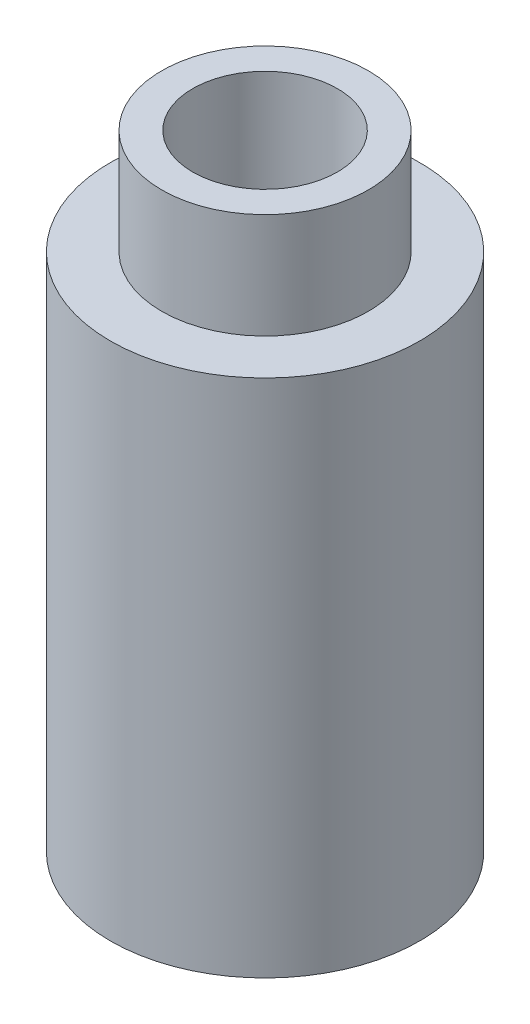
ISO-10303-21;
HEADER;
FILE_DESCRIPTION(('STEP AP214'),'2;1');
FILE_NAME('part.step','',(''),(''),'','','');
FILE_SCHEMA(('AUTOMOTIVE_DESIGN { 1 0 10303 214 1 1 1 1 }'));
ENDSEC;
DATA;
#1=APPLICATION_CONTEXT('core data for automotive mechanical design processes');
#2=APPLICATION_PROTOCOL_DEFINITION('international standard','automotive_design',2000,#1);
#3=PRODUCT_CONTEXT('',#1,'mechanical');
#4=PRODUCT('Part','Part','',(#3));
#5=PRODUCT_RELATED_PRODUCT_CATEGORY('part','',(#4));
#6=PRODUCT_DEFINITION_FORMATION('','',#4);
#7=PRODUCT_DEFINITION_CONTEXT('part definition',#1,'design');
#8=PRODUCT_DEFINITION('design','',#6,#7);
#9=PRODUCT_DEFINITION_SHAPE('','',#8);
#10=(LENGTH_UNIT() NAMED_UNIT(*) SI_UNIT(.MILLI.,.METRE.));
#11=(NAMED_UNIT(*) PLANE_ANGLE_UNIT() SI_UNIT($,.RADIAN.));
#12=(NAMED_UNIT(*) SI_UNIT($,.STERADIAN.) SOLID_ANGLE_UNIT());
#13=UNCERTAINTY_MEASURE_WITH_UNIT(LENGTH_MEASURE(1.E-05),#10,'distance_accuracy_value','');
#14=(GEOMETRIC_REPRESENTATION_CONTEXT(3) GLOBAL_UNCERTAINTY_ASSIGNED_CONTEXT((#13)) GLOBAL_UNIT_ASSIGNED_CONTEXT((#10,
#11,#12)) REPRESENTATION_CONTEXT('',''));
#15=CARTESIAN_POINT('',(0.,0.,0.));
#16=DIRECTION('',(0.,0.,1.));
#17=DIRECTION('',(1.,0.,0.));
#18=AXIS2_PLACEMENT_3D('',#15,#16,#17);
#19=CARTESIAN_POINT('',(0.,31.75,0.));
#20=DIRECTION('',(0.,1.,0.));
#21=DIRECTION('',(0.,0.,1.));
#22=AXIS2_PLACEMENT_3D('',#19,#20,#21);
#23=PLANE('',#22);
#24=CARTESIAN_POINT('',(0.,31.75,0.));
#25=DIRECTION('',(0.,1.,0.));
#26=DIRECTION('',(0.,0.,1.));
#27=AXIS2_PLACEMENT_3D('',#24,#25,#26);
#28=CIRCLE('',#27,9.4488);
#29=CARTESIAN_POINT('',(0.,31.75,9.4488));
#30=VERTEX_POINT('',#29);
#31=EDGE_CURVE('E10',#30,#30,#28,.T.);
#32=ORIENTED_EDGE('',*,*,#31,.T.);
#33=EDGE_LOOP('',(#32));
#34=FACE_BOUND('',#33,.T.);
#35=CARTESIAN_POINT('',(0.,31.75,0.));
#36=DIRECTION('',(0.,1.,0.));
#37=DIRECTION('',(0.,0.,1.));
#38=AXIS2_PLACEMENT_3D('',#35,#36,#37);
#39=CIRCLE('',#38,6.3119);
#40=CARTESIAN_POINT('',(0.,31.75,6.3119));
#41=VERTEX_POINT('',#40);
#42=EDGE_CURVE('E44',#41,#41,#39,.T.);
#43=ORIENTED_EDGE('',*,*,#42,.F.);
#44=EDGE_LOOP('',(#43));
#45=FACE_BOUND('',#44,.T.);
#46=ADVANCED_FACE('F31',(#34,#45),#23,.T.);
#47=CARTESIAN_POINT('',(0.,31.75,0.));
#48=DIRECTION('',(0.,-1.,0.));
#49=DIRECTION('',(0.,0.,-1.));
#50=AXIS2_PLACEMENT_3D('',#47,#48,#49);
#51=CYLINDRICAL_SURFACE('',#50,9.4488);
#52=ORIENTED_EDGE('',*,*,#31,.F.);
#53=EDGE_LOOP('',(#52));
#54=FACE_BOUND('',#53,.T.);
#55=CARTESIAN_POINT('',(0.,0.,0.));
#56=DIRECTION('',(0.,1.,0.));
#57=DIRECTION('',(0.,0.,1.));
#58=AXIS2_PLACEMENT_3D('',#55,#56,#57);
#59=CIRCLE('',#58,9.4488);
#60=CARTESIAN_POINT('',(0.,0.,9.4488));
#61=VERTEX_POINT('',#60);
#62=EDGE_CURVE('E35',#61,#61,#59,.T.);
#63=ORIENTED_EDGE('',*,*,#62,.T.);
#64=EDGE_LOOP('',(#63));
#65=FACE_BOUND('',#64,.T.);
#66=ADVANCED_FACE('F33',(#54,#65),#51,.T.);
#67=CARTESIAN_POINT('',(0.,0.,0.));
#68=DIRECTION('',(0.,1.,0.));
#69=DIRECTION('',(0.,0.,1.));
#70=AXIS2_PLACEMENT_3D('',#67,#68,#69);
#71=PLANE('',#70);
#72=CARTESIAN_POINT('',(0.,0.,0.));
#73=DIRECTION('',(0.,1.,0.));
#74=DIRECTION('',(0.,0.,1.));
#75=AXIS2_PLACEMENT_3D('',#72,#73,#74);
#76=CIRCLE('',#75,4.4196);
#77=CARTESIAN_POINT('',(0.,0.,4.4196));
#78=VERTEX_POINT('',#77);
#79=EDGE_CURVE('E47',#78,#78,#76,.T.);
#80=ORIENTED_EDGE('',*,*,#79,.T.);
#81=EDGE_LOOP('',(#80));
#82=FACE_BOUND('',#81,.T.);
#83=ORIENTED_EDGE('',*,*,#62,.F.);
#84=EDGE_LOOP('',(#83));
#85=FACE_BOUND('',#84,.T.);
#86=ADVANCED_FACE('F56',(#82,#85),#71,.F.);
#87=CARTESIAN_POINT('',(0.,38.1762,0.));
#88=DIRECTION('',(0.,-1.,0.));
#89=DIRECTION('',(0.,0.,-1.));
#90=AXIS2_PLACEMENT_3D('',#87,#88,#89);
#91=CYLINDRICAL_SURFACE('',#90,6.3119);
#92=CARTESIAN_POINT('',(0.,38.1762,0.));
#93=DIRECTION('',(0.,1.,0.));
#94=DIRECTION('',(0.,0.,1.));
#95=AXIS2_PLACEMENT_3D('',#92,#93,#94);
#96=CIRCLE('',#95,6.3119);
#97=CARTESIAN_POINT('',(0.,38.1762,6.3119));
#98=VERTEX_POINT('',#97);
#99=EDGE_CURVE('E42',#98,#98,#96,.T.);
#100=ORIENTED_EDGE('',*,*,#99,.F.);
#101=EDGE_LOOP('',(#100));
#102=FACE_BOUND('',#101,.T.);
#103=ORIENTED_EDGE('',*,*,#42,.T.);
#104=EDGE_LOOP('',(#103));
#105=FACE_BOUND('',#104,.T.);
#106=ADVANCED_FACE('F68',(#102,#105),#91,.T.);
#107=CARTESIAN_POINT('',(0.,38.1762,0.));
#108=DIRECTION('',(0.,1.,0.));
#109=DIRECTION('',(0.,0.,1.));
#110=AXIS2_PLACEMENT_3D('',#107,#108,#109);
#111=PLANE('',#110);
#112=CARTESIAN_POINT('',(0.,38.1762,0.));
#113=DIRECTION('',(0.,1.,0.));
#114=DIRECTION('',(0.,0.,1.));
#115=AXIS2_PLACEMENT_3D('',#112,#113,#114);
#116=CIRCLE('',#115,4.4196);
#117=CARTESIAN_POINT('',(0.,38.1762,4.4196));
#118=VERTEX_POINT('',#117);
#119=EDGE_CURVE('E50',#118,#118,#116,.T.);
#120=ORIENTED_EDGE('',*,*,#119,.F.);
#121=EDGE_LOOP('',(#120));
#122=FACE_BOUND('',#121,.T.);
#123=ORIENTED_EDGE('',*,*,#99,.T.);
#124=EDGE_LOOP('',(#123));
#125=FACE_BOUND('',#124,.T.);
#126=ADVANCED_FACE('F62',(#122,#125),#111,.T.);
#127=CARTESIAN_POINT('',(0.,0.,0.));
#128=DIRECTION('',(0.,1.,0.));
#129=DIRECTION('',(0.,0.,1.));
#130=AXIS2_PLACEMENT_3D('',#127,#128,#129);
#131=CYLINDRICAL_SURFACE('',#130,4.4196);
#132=ORIENTED_EDGE('',*,*,#79,.F.);
#133=EDGE_LOOP('',(#132));
#134=FACE_BOUND('',#133,.T.);
#135=ORIENTED_EDGE('',*,*,#119,.T.);
#136=EDGE_LOOP('',(#135));
#137=FACE_BOUND('',#136,.T.);
#138=ADVANCED_FACE('F59',(#134,#137),#131,.F.);
#139=CLOSED_SHELL('',(#46,#66,#86,#106,#126,#138));
#140=MANIFOLD_SOLID_BREP('B2',#139);
#141=ADVANCED_BREP_SHAPE_REPRESENTATION('',(#18,#140),#14);
#142=SHAPE_DEFINITION_REPRESENTATION(#9,#141);
ENDSEC;
END-ISO-10303-21;
